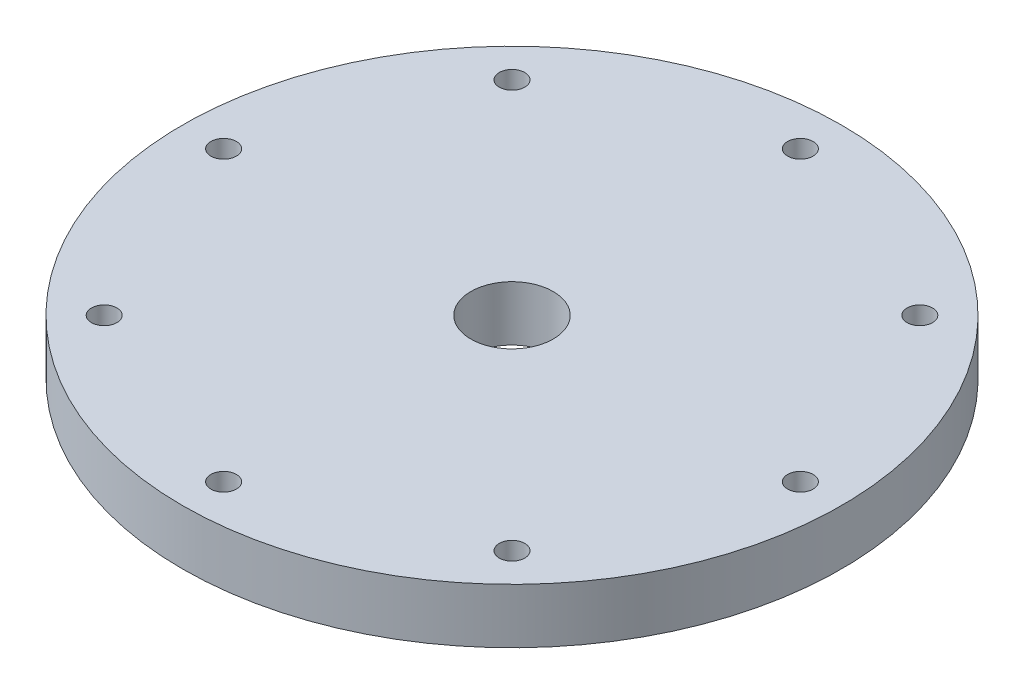
ISO-10303-21;
HEADER;
FILE_DESCRIPTION(('STEP AP214'),'2;1');
FILE_NAME('part.step','',(''),(''),'','','');
FILE_SCHEMA(('AUTOMOTIVE_DESIGN { 1 0 10303 214 1 1 1 1 }'));
ENDSEC;
DATA;
#1=APPLICATION_CONTEXT('core data for automotive mechanical design processes');
#2=APPLICATION_PROTOCOL_DEFINITION('international standard','automotive_design',2000,#1);
#3=PRODUCT_CONTEXT('',#1,'mechanical');
#4=PRODUCT('Part','Part','',(#3));
#5=PRODUCT_RELATED_PRODUCT_CATEGORY('part','',(#4));
#6=PRODUCT_DEFINITION_FORMATION('','',#4);
#7=PRODUCT_DEFINITION_CONTEXT('part definition',#1,'design');
#8=PRODUCT_DEFINITION('design','',#6,#7);
#9=PRODUCT_DEFINITION_SHAPE('','',#8);
#10=(LENGTH_UNIT() NAMED_UNIT(*) SI_UNIT(.MILLI.,.METRE.));
#11=(NAMED_UNIT(*) PLANE_ANGLE_UNIT() SI_UNIT($,.RADIAN.));
#12=(NAMED_UNIT(*) SI_UNIT($,.STERADIAN.) SOLID_ANGLE_UNIT());
#13=UNCERTAINTY_MEASURE_WITH_UNIT(LENGTH_MEASURE(1.E-05),#10,'distance_accuracy_value','');
#14=(GEOMETRIC_REPRESENTATION_CONTEXT(3) GLOBAL_UNCERTAINTY_ASSIGNED_CONTEXT((#13)) GLOBAL_UNIT_ASSIGNED_CONTEXT((#10,
#11,#12)) REPRESENTATION_CONTEXT('',''));
#15=CARTESIAN_POINT('',(0.,0.,0.));
#16=DIRECTION('',(0.,0.,1.));
#17=DIRECTION('',(1.,0.,0.));
#18=AXIS2_PLACEMENT_3D('',#15,#16,#17);
#19=CARTESIAN_POINT('',(0.,6.35,0.));
#20=DIRECTION('',(0.,-1.,0.));
#21=DIRECTION('',(0.,0.,-1.));
#22=AXIS2_PLACEMENT_3D('',#19,#20,#21);
#23=CYLINDRICAL_SURFACE('',#22,38.1);
#24=CARTESIAN_POINT('',(0.,6.35,0.));
#25=DIRECTION('',(0.,1.,0.));
#26=DIRECTION('',(0.,0.,1.));
#27=AXIS2_PLACEMENT_3D('',#24,#25,#26);
#28=CIRCLE('',#27,38.1);
#29=CARTESIAN_POINT('',(0.,6.35,38.1));
#30=VERTEX_POINT('',#29);
#31=EDGE_CURVE('E10',#30,#30,#28,.T.);
#32=ORIENTED_EDGE('',*,*,#31,.F.);
#33=EDGE_LOOP('',(#32));
#34=FACE_BOUND('',#33,.T.);
#35=CARTESIAN_POINT('',(0.,0.,0.));
#36=DIRECTION('',(0.,1.,0.));
#37=DIRECTION('',(0.,0.,1.));
#38=AXIS2_PLACEMENT_3D('',#35,#36,#37);
#39=CIRCLE('',#38,38.1);
#40=CARTESIAN_POINT('',(0.,0.,38.1));
#41=VERTEX_POINT('',#40);
#42=EDGE_CURVE('E34',#41,#41,#39,.T.);
#43=ORIENTED_EDGE('',*,*,#42,.T.);
#44=EDGE_LOOP('',(#43));
#45=FACE_BOUND('',#44,.T.);
#46=ADVANCED_FACE('F31',(#34,#45),#23,.T.);
#47=CARTESIAN_POINT('',(0.,6.35,0.));
#48=DIRECTION('',(0.,1.,0.));
#49=DIRECTION('',(0.,0.,1.));
#50=AXIS2_PLACEMENT_3D('',#47,#48,#49);
#51=PLANE('',#50);
#52=CARTESIAN_POINT('',(0.,6.35,0.));
#53=DIRECTION('',(0.,-1.,0.));
#54=DIRECTION('',(0.,0.,-1.));
#55=AXIS2_PLACEMENT_3D('',#52,#53,#54);
#56=CIRCLE('',#55,4.7625);
#57=CARTESIAN_POINT('',(0.,6.35,-4.7625));
#58=VERTEX_POINT('',#57);
#59=EDGE_CURVE('E138',#58,#58,#56,.T.);
#60=ORIENTED_EDGE('',*,*,#59,.T.);
#61=EDGE_LOOP('',(#60));
#62=FACE_BOUND('',#61,.T.);
#63=CARTESIAN_POINT('',(-23.5731723178062,6.35,23.5731723178068));
#64=DIRECTION('',(0.,-1.,0.));
#65=DIRECTION('',(0.,0.,-1.));
#66=AXIS2_PLACEMENT_3D('',#63,#64,#65);
#67=CIRCLE('',#66,1.4732);
#68=CARTESIAN_POINT('',(-23.5731723178062,6.35,22.0999723178068));
#69=VERTEX_POINT('',#68);
#70=EDGE_CURVE('E126',#69,#69,#67,.T.);
#71=ORIENTED_EDGE('',*,*,#70,.T.);
#72=EDGE_LOOP('',(#71));
#73=FACE_BOUND('',#72,.T.);
#74=CARTESIAN_POINT('',(-33.3375,6.35,3.49191777401049E-13));
#75=DIRECTION('',(0.,-1.,0.));
#76=DIRECTION('',(0.,0.,-1.));
#77=AXIS2_PLACEMENT_3D('',#74,#75,#76);
#78=CIRCLE('',#77,1.4732);
#79=CARTESIAN_POINT('',(-33.3375,6.35,-1.47319999999965));
#80=VERTEX_POINT('',#79);
#81=EDGE_CURVE('E114',#80,#80,#78,.T.);
#82=ORIENTED_EDGE('',*,*,#81,.T.);
#83=EDGE_LOOP('',(#82));
#84=FACE_BOUND('',#83,.T.);
#85=CARTESIAN_POINT('',(-23.5731723178067,6.35,-23.5731723178063));
#86=DIRECTION('',(0.,-1.,0.));
#87=DIRECTION('',(0.,0.,-1.));
#88=AXIS2_PLACEMENT_3D('',#85,#86,#87);
#89=CIRCLE('',#88,1.4732);
#90=CARTESIAN_POINT('',(-23.5731723178067,6.35,-25.0463723178063));
#91=VERTEX_POINT('',#90);
#92=EDGE_CURVE('E102',#91,#91,#89,.T.);
#93=ORIENTED_EDGE('',*,*,#92,.T.);
#94=EDGE_LOOP('',(#93));
#95=FACE_BOUND('',#94,.T.);
#96=CARTESIAN_POINT('',(0.,6.35,-33.3375));
#97=DIRECTION('',(0.,-1.,0.));
#98=DIRECTION('',(0.,0.,-1.));
#99=AXIS2_PLACEMENT_3D('',#96,#97,#98);
#100=CIRCLE('',#99,1.4732);
#101=CARTESIAN_POINT('',(0.,6.35,-34.8107));
#102=VERTEX_POINT('',#101);
#103=EDGE_CURVE('E90',#102,#102,#100,.T.);
#104=ORIENTED_EDGE('',*,*,#103,.T.);
#105=EDGE_LOOP('',(#104));
#106=FACE_BOUND('',#105,.T.);
#107=CARTESIAN_POINT('',(23.5731723178064,6.35,-23.5731723178067));
#108=DIRECTION('',(0.,-1.,0.));
#109=DIRECTION('',(0.,0.,-1.));
#110=AXIS2_PLACEMENT_3D('',#107,#108,#109);
#111=CIRCLE('',#110,1.4732);
#112=CARTESIAN_POINT('',(23.5731723178064,6.35,-25.0463723178067));
#113=VERTEX_POINT('',#112);
#114=EDGE_CURVE('E78',#113,#113,#111,.T.);
#115=ORIENTED_EDGE('',*,*,#114,.T.);
#116=EDGE_LOOP('',(#115));
#117=FACE_BOUND('',#116,.T.);
#118=CARTESIAN_POINT('',(33.3375,6.35,-1.16397259133683E-13));
#119=DIRECTION('',(0.,-1.,0.));
#120=DIRECTION('',(0.,0.,-1.));
#121=AXIS2_PLACEMENT_3D('',#118,#119,#120);
#122=CIRCLE('',#121,1.4732);
#123=CARTESIAN_POINT('',(33.3375,6.35,-1.47320000000012));
#124=VERTEX_POINT('',#123);
#125=EDGE_CURVE('E66',#124,#124,#122,.T.);
#126=ORIENTED_EDGE('',*,*,#125,.T.);
#127=EDGE_LOOP('',(#126));
#128=FACE_BOUND('',#127,.T.);
#129=CARTESIAN_POINT('',(23.5731723178066,6.35,23.5731723178065));
#130=DIRECTION('',(0.,-1.,0.));
#131=DIRECTION('',(0.,0.,-1.));
#132=AXIS2_PLACEMENT_3D('',#129,#130,#131);
#133=CIRCLE('',#132,1.4732);
#134=CARTESIAN_POINT('',(23.5731723178066,6.35,22.0999723178065));
#135=VERTEX_POINT('',#134);
#136=EDGE_CURVE('E54',#135,#135,#133,.T.);
#137=ORIENTED_EDGE('',*,*,#136,.T.);
#138=EDGE_LOOP('',(#137));
#139=FACE_BOUND('',#138,.T.);
#140=CARTESIAN_POINT('',(0.,6.35,33.3375));
#141=DIRECTION('',(0.,-1.,0.));
#142=DIRECTION('',(0.,0.,-1.));
#143=AXIS2_PLACEMENT_3D('',#140,#141,#142);
#144=CIRCLE('',#143,1.4732);
#145=CARTESIAN_POINT('',(0.,6.35,31.8643));
#146=VERTEX_POINT('',#145);
#147=EDGE_CURVE('E41',#146,#146,#144,.T.);
#148=ORIENTED_EDGE('',*,*,#147,.T.);
#149=EDGE_LOOP('',(#148));
#150=FACE_BOUND('',#149,.T.);
#151=ORIENTED_EDGE('',*,*,#31,.T.);
#152=EDGE_LOOP('',(#151));
#153=FACE_BOUND('',#152,.T.);
#154=ADVANCED_FACE('F145',(#62,#73,#84,#95,#106,#117,#128,#139,#150,#153),#51,.T.);
#155=CARTESIAN_POINT('',(0.,0.,0.));
#156=DIRECTION('',(0.,1.,0.));
#157=DIRECTION('',(0.,0.,1.));
#158=AXIS2_PLACEMENT_3D('',#155,#156,#157);
#159=PLANE('',#158);
#160=CARTESIAN_POINT('',(0.,0.,0.));
#161=DIRECTION('',(0.,-1.,0.));
#162=DIRECTION('',(0.,0.,-1.));
#163=AXIS2_PLACEMENT_3D('',#160,#161,#162);
#164=CIRCLE('',#163,4.7625);
#165=CARTESIAN_POINT('',(0.,0.,-4.7625));
#166=VERTEX_POINT('',#165);
#167=EDGE_CURVE('E139',#166,#166,#164,.T.);
#168=ORIENTED_EDGE('',*,*,#167,.F.);
#169=EDGE_LOOP('',(#168));
#170=FACE_BOUND('',#169,.T.);
#171=CARTESIAN_POINT('',(-23.5731723178062,0.,23.5731723178068));
#172=DIRECTION('',(0.,-1.,0.));
#173=DIRECTION('',(0.,0.,-1.));
#174=AXIS2_PLACEMENT_3D('',#171,#172,#173);
#175=CIRCLE('',#174,2.8575);
#176=CARTESIAN_POINT('',(-23.5731723178062,0.,20.7156723178068));
#177=VERTEX_POINT('',#176);
#178=EDGE_CURVE('E135',#177,#177,#175,.T.);
#179=ORIENTED_EDGE('',*,*,#178,.F.);
#180=EDGE_LOOP('',(#179));
#181=FACE_BOUND('',#180,.T.);
#182=CARTESIAN_POINT('',(-33.3375,0.,3.49191777401049E-13));
#183=DIRECTION('',(0.,-1.,0.));
#184=DIRECTION('',(0.,0.,-1.));
#185=AXIS2_PLACEMENT_3D('',#182,#183,#184);
#186=CIRCLE('',#185,2.8575);
#187=CARTESIAN_POINT('',(-33.3375,0.,-2.85749999999965));
#188=VERTEX_POINT('',#187);
#189=EDGE_CURVE('E123',#188,#188,#186,.T.);
#190=ORIENTED_EDGE('',*,*,#189,.F.);
#191=EDGE_LOOP('',(#190));
#192=FACE_BOUND('',#191,.T.);
#193=CARTESIAN_POINT('',(-23.5731723178067,0.,-23.5731723178063));
#194=DIRECTION('',(0.,-1.,0.));
#195=DIRECTION('',(0.,0.,-1.));
#196=AXIS2_PLACEMENT_3D('',#193,#194,#195);
#197=CIRCLE('',#196,2.8575);
#198=CARTESIAN_POINT('',(-23.5731723178067,0.,-26.4306723178063));
#199=VERTEX_POINT('',#198);
#200=EDGE_CURVE('E111',#199,#199,#197,.T.);
#201=ORIENTED_EDGE('',*,*,#200,.F.);
#202=EDGE_LOOP('',(#201));
#203=FACE_BOUND('',#202,.T.);
#204=CARTESIAN_POINT('',(0.,0.,-33.3375));
#205=DIRECTION('',(0.,-1.,0.));
#206=DIRECTION('',(0.,0.,-1.));
#207=AXIS2_PLACEMENT_3D('',#204,#205,#206);
#208=CIRCLE('',#207,2.8575);
#209=CARTESIAN_POINT('',(0.,0.,-36.195));
#210=VERTEX_POINT('',#209);
#211=EDGE_CURVE('E99',#210,#210,#208,.T.);
#212=ORIENTED_EDGE('',*,*,#211,.F.);
#213=EDGE_LOOP('',(#212));
#214=FACE_BOUND('',#213,.T.);
#215=CARTESIAN_POINT('',(23.5731723178064,0.,-23.5731723178067));
#216=DIRECTION('',(0.,-1.,0.));
#217=DIRECTION('',(0.,0.,-1.));
#218=AXIS2_PLACEMENT_3D('',#215,#216,#217);
#219=CIRCLE('',#218,2.8575);
#220=CARTESIAN_POINT('',(23.5731723178064,0.,-26.4306723178066));
#221=VERTEX_POINT('',#220);
#222=EDGE_CURVE('E87',#221,#221,#219,.T.);
#223=ORIENTED_EDGE('',*,*,#222,.F.);
#224=EDGE_LOOP('',(#223));
#225=FACE_BOUND('',#224,.T.);
#226=CARTESIAN_POINT('',(33.3375,0.,-1.16397259133683E-13));
#227=DIRECTION('',(0.,-1.,0.));
#228=DIRECTION('',(0.,0.,-1.));
#229=AXIS2_PLACEMENT_3D('',#226,#227,#228);
#230=CIRCLE('',#229,2.8575);
#231=CARTESIAN_POINT('',(33.3375,0.,-2.85750000000011));
#232=VERTEX_POINT('',#231);
#233=EDGE_CURVE('E75',#232,#232,#230,.T.);
#234=ORIENTED_EDGE('',*,*,#233,.F.);
#235=EDGE_LOOP('',(#234));
#236=FACE_BOUND('',#235,.T.);
#237=CARTESIAN_POINT('',(23.5731723178066,0.,23.5731723178065));
#238=DIRECTION('',(0.,-1.,0.));
#239=DIRECTION('',(0.,0.,-1.));
#240=AXIS2_PLACEMENT_3D('',#237,#238,#239);
#241=CIRCLE('',#240,2.8575);
#242=CARTESIAN_POINT('',(23.5731723178066,0.,20.7156723178065));
#243=VERTEX_POINT('',#242);
#244=EDGE_CURVE('E63',#243,#243,#241,.T.);
#245=ORIENTED_EDGE('',*,*,#244,.F.);
#246=EDGE_LOOP('',(#245));
#247=FACE_BOUND('',#246,.T.);
#248=CARTESIAN_POINT('',(0.,0.,33.3375));
#249=DIRECTION('',(0.,-1.,0.));
#250=DIRECTION('',(0.,0.,-1.));
#251=AXIS2_PLACEMENT_3D('',#248,#249,#250);
#252=CIRCLE('',#251,2.8575);
#253=CARTESIAN_POINT('',(0.,0.,30.48));
#254=VERTEX_POINT('',#253);
#255=EDGE_CURVE('E51',#254,#254,#252,.T.);
#256=ORIENTED_EDGE('',*,*,#255,.F.);
#257=EDGE_LOOP('',(#256));
#258=FACE_BOUND('',#257,.T.);
#259=ORIENTED_EDGE('',*,*,#42,.F.);
#260=EDGE_LOOP('',(#259));
#261=FACE_BOUND('',#260,.T.);
#262=ADVANCED_FACE('F155',(#170,#181,#192,#203,#214,#225,#236,#247,#258,#261),#159,.F.);
#263=CARTESIAN_POINT('',(0.,0.,33.3375));
#264=DIRECTION('',(0.,-1.,0.));
#265=DIRECTION('',(0.,0.,-1.));
#266=AXIS2_PLACEMENT_3D('',#263,#264,#265);
#267=CYLINDRICAL_SURFACE('',#266,1.4732);
#268=ORIENTED_EDGE('',*,*,#147,.F.);
#269=EDGE_LOOP('',(#268));
#270=FACE_BOUND('',#269,.T.);
#271=CARTESIAN_POINT('',(0.,1.4986,33.3375));
#272=DIRECTION('',(0.,-1.,0.));
#273=DIRECTION('',(0.,0.,-1.));
#274=AXIS2_PLACEMENT_3D('',#271,#272,#273);
#275=CIRCLE('',#274,1.4732);
#276=CARTESIAN_POINT('',(0.,1.4986,31.8643));
#277=VERTEX_POINT('',#276);
#278=EDGE_CURVE('E45',#277,#277,#275,.T.);
#279=ORIENTED_EDGE('',*,*,#278,.T.);
#280=EDGE_LOOP('',(#279));
#281=FACE_BOUND('',#280,.T.);
#282=ADVANCED_FACE('F158',(#270,#281),#267,.F.);
#283=CARTESIAN_POINT('',(1.4732,1.4986,33.3375));
#284=DIRECTION('',(0.,1.,0.));
#285=DIRECTION('',(0.,0.,1.));
#286=AXIS2_PLACEMENT_3D('',#283,#284,#285);
#287=PLANE('',#286);
#288=ORIENTED_EDGE('',*,*,#278,.F.);
#289=EDGE_LOOP('',(#288));
#290=FACE_BOUND('',#289,.T.);
#291=CARTESIAN_POINT('',(0.,1.4986,33.3375));
#292=DIRECTION('',(0.,-1.,0.));
#293=DIRECTION('',(0.,0.,-1.));
#294=AXIS2_PLACEMENT_3D('',#291,#292,#293);
#295=CIRCLE('',#294,2.8575);
#296=CARTESIAN_POINT('',(0.,1.4986,30.48));
#297=VERTEX_POINT('',#296);
#298=EDGE_CURVE('E48',#297,#297,#295,.T.);
#299=ORIENTED_EDGE('',*,*,#298,.T.);
#300=EDGE_LOOP('',(#299));
#301=FACE_BOUND('',#300,.T.);
#302=ADVANCED_FACE('F188',(#290,#301),#287,.F.);
#303=CARTESIAN_POINT('',(0.,0.,33.3375));
#304=DIRECTION('',(0.,-1.,0.));
#305=DIRECTION('',(0.,0.,-1.));
#306=AXIS2_PLACEMENT_3D('',#303,#304,#305);
#307=CYLINDRICAL_SURFACE('',#306,2.8575);
#308=ORIENTED_EDGE('',*,*,#298,.F.);
#309=EDGE_LOOP('',(#308));
#310=FACE_BOUND('',#309,.T.);
#311=ORIENTED_EDGE('',*,*,#255,.T.);
#312=EDGE_LOOP('',(#311));
#313=FACE_BOUND('',#312,.T.);
#314=ADVANCED_FACE('F192',(#310,#313),#307,.F.);
#315=CARTESIAN_POINT('',(23.5731723178066,0.,23.5731723178065));
#316=DIRECTION('',(0.,-1.,0.));
#317=DIRECTION('',(0.,0.,-1.));
#318=AXIS2_PLACEMENT_3D('',#315,#316,#317);
#319=CYLINDRICAL_SURFACE('',#318,1.4732);
#320=ORIENTED_EDGE('',*,*,#136,.F.);
#321=EDGE_LOOP('',(#320));
#322=FACE_BOUND('',#321,.T.);
#323=CARTESIAN_POINT('',(23.5731723178066,1.4986,23.5731723178065));
#324=DIRECTION('',(0.,-1.,0.));
#325=DIRECTION('',(0.,0.,-1.));
#326=AXIS2_PLACEMENT_3D('',#323,#324,#325);
#327=CIRCLE('',#326,1.4732);
#328=CARTESIAN_POINT('',(23.5731723178066,1.4986,22.0999723178065));
#329=VERTEX_POINT('',#328);
#330=EDGE_CURVE('E57',#329,#329,#327,.T.);
#331=ORIENTED_EDGE('',*,*,#330,.T.);
#332=EDGE_LOOP('',(#331));
#333=FACE_BOUND('',#332,.T.);
#334=ADVANCED_FACE('F196',(#322,#333),#319,.F.);
#335=CARTESIAN_POINT('',(25.0463723178066,1.4986,23.5731723178065));
#336=DIRECTION('',(0.,1.,0.));
#337=DIRECTION('',(0.,0.,1.));
#338=AXIS2_PLACEMENT_3D('',#335,#336,#337);
#339=PLANE('',#338);
#340=ORIENTED_EDGE('',*,*,#330,.F.);
#341=EDGE_LOOP('',(#340));
#342=FACE_BOUND('',#341,.T.);
#343=CARTESIAN_POINT('',(23.5731723178066,1.4986,23.5731723178065));
#344=DIRECTION('',(0.,-1.,0.));
#345=DIRECTION('',(0.,0.,-1.));
#346=AXIS2_PLACEMENT_3D('',#343,#344,#345);
#347=CIRCLE('',#346,2.8575);
#348=CARTESIAN_POINT('',(23.5731723178066,1.4986,20.7156723178065));
#349=VERTEX_POINT('',#348);
#350=EDGE_CURVE('E60',#349,#349,#347,.T.);
#351=ORIENTED_EDGE('',*,*,#350,.T.);
#352=EDGE_LOOP('',(#351));
#353=FACE_BOUND('',#352,.T.);
#354=ADVANCED_FACE('F200',(#342,#353),#339,.F.);
#355=CARTESIAN_POINT('',(23.5731723178066,0.,23.5731723178065));
#356=DIRECTION('',(0.,-1.,0.));
#357=DIRECTION('',(0.,0.,-1.));
#358=AXIS2_PLACEMENT_3D('',#355,#356,#357);
#359=CYLINDRICAL_SURFACE('',#358,2.8575);
#360=ORIENTED_EDGE('',*,*,#350,.F.);
#361=EDGE_LOOP('',(#360));
#362=FACE_BOUND('',#361,.T.);
#363=ORIENTED_EDGE('',*,*,#244,.T.);
#364=EDGE_LOOP('',(#363));
#365=FACE_BOUND('',#364,.T.);
#366=ADVANCED_FACE('F204',(#362,#365),#359,.F.);
#367=CARTESIAN_POINT('',(33.3375,0.,-1.16397259133683E-13));
#368=DIRECTION('',(0.,-1.,0.));
#369=DIRECTION('',(0.,0.,-1.));
#370=AXIS2_PLACEMENT_3D('',#367,#368,#369);
#371=CYLINDRICAL_SURFACE('',#370,1.4732);
#372=ORIENTED_EDGE('',*,*,#125,.F.);
#373=EDGE_LOOP('',(#372));
#374=FACE_BOUND('',#373,.T.);
#375=CARTESIAN_POINT('',(33.3375,1.4986,-1.16397259133683E-13));
#376=DIRECTION('',(0.,-1.,0.));
#377=DIRECTION('',(0.,0.,-1.));
#378=AXIS2_PLACEMENT_3D('',#375,#376,#377);
#379=CIRCLE('',#378,1.4732);
#380=CARTESIAN_POINT('',(33.3375,1.4986,-1.47320000000012));
#381=VERTEX_POINT('',#380);
#382=EDGE_CURVE('E69',#381,#381,#379,.T.);
#383=ORIENTED_EDGE('',*,*,#382,.T.);
#384=EDGE_LOOP('',(#383));
#385=FACE_BOUND('',#384,.T.);
#386=ADVANCED_FACE('F208',(#374,#385),#371,.F.);
#387=CARTESIAN_POINT('',(34.8107,1.4986,-1.16397259133683E-13));
#388=DIRECTION('',(0.,1.,0.));
#389=DIRECTION('',(0.,0.,1.));
#390=AXIS2_PLACEMENT_3D('',#387,#388,#389);
#391=PLANE('',#390);
#392=ORIENTED_EDGE('',*,*,#382,.F.);
#393=EDGE_LOOP('',(#392));
#394=FACE_BOUND('',#393,.T.);
#395=CARTESIAN_POINT('',(33.3375,1.4986,-1.16397259133683E-13));
#396=DIRECTION('',(0.,-1.,0.));
#397=DIRECTION('',(0.,0.,-1.));
#398=AXIS2_PLACEMENT_3D('',#395,#396,#397);
#399=CIRCLE('',#398,2.8575);
#400=CARTESIAN_POINT('',(33.3375,1.4986,-2.85750000000011));
#401=VERTEX_POINT('',#400);
#402=EDGE_CURVE('E72',#401,#401,#399,.T.);
#403=ORIENTED_EDGE('',*,*,#402,.T.);
#404=EDGE_LOOP('',(#403));
#405=FACE_BOUND('',#404,.T.);
#406=ADVANCED_FACE('F212',(#394,#405),#391,.F.);
#407=CARTESIAN_POINT('',(33.3375,0.,-1.16397259133683E-13));
#408=DIRECTION('',(0.,-1.,0.));
#409=DIRECTION('',(0.,0.,-1.));
#410=AXIS2_PLACEMENT_3D('',#407,#408,#409);
#411=CYLINDRICAL_SURFACE('',#410,2.8575);
#412=ORIENTED_EDGE('',*,*,#402,.F.);
#413=EDGE_LOOP('',(#412));
#414=FACE_BOUND('',#413,.T.);
#415=ORIENTED_EDGE('',*,*,#233,.T.);
#416=EDGE_LOOP('',(#415));
#417=FACE_BOUND('',#416,.T.);
#418=ADVANCED_FACE('F216',(#414,#417),#411,.F.);
#419=CARTESIAN_POINT('',(23.5731723178064,0.,-23.5731723178067));
#420=DIRECTION('',(0.,-1.,0.));
#421=DIRECTION('',(0.,0.,-1.));
#422=AXIS2_PLACEMENT_3D('',#419,#420,#421);
#423=CYLINDRICAL_SURFACE('',#422,1.4732);
#424=ORIENTED_EDGE('',*,*,#114,.F.);
#425=EDGE_LOOP('',(#424));
#426=FACE_BOUND('',#425,.T.);
#427=CARTESIAN_POINT('',(23.5731723178064,1.4986,-23.5731723178067));
#428=DIRECTION('',(0.,-1.,0.));
#429=DIRECTION('',(0.,0.,-1.));
#430=AXIS2_PLACEMENT_3D('',#427,#428,#429);
#431=CIRCLE('',#430,1.4732);
#432=CARTESIAN_POINT('',(23.5731723178064,1.4986,-25.0463723178067));
#433=VERTEX_POINT('',#432);
#434=EDGE_CURVE('E81',#433,#433,#431,.T.);
#435=ORIENTED_EDGE('',*,*,#434,.T.);
#436=EDGE_LOOP('',(#435));
#437=FACE_BOUND('',#436,.T.);
#438=ADVANCED_FACE('F220',(#426,#437),#423,.F.);
#439=CARTESIAN_POINT('',(25.0463723178064,1.4986,-23.5731723178067));
#440=DIRECTION('',(0.,1.,0.));
#441=DIRECTION('',(0.,0.,1.));
#442=AXIS2_PLACEMENT_3D('',#439,#440,#441);
#443=PLANE('',#442);
#444=ORIENTED_EDGE('',*,*,#434,.F.);
#445=EDGE_LOOP('',(#444));
#446=FACE_BOUND('',#445,.T.);
#447=CARTESIAN_POINT('',(23.5731723178064,1.4986,-23.5731723178067));
#448=DIRECTION('',(0.,-1.,0.));
#449=DIRECTION('',(0.,0.,-1.));
#450=AXIS2_PLACEMENT_3D('',#447,#448,#449);
#451=CIRCLE('',#450,2.8575);
#452=CARTESIAN_POINT('',(23.5731723178064,1.4986,-26.4306723178066));
#453=VERTEX_POINT('',#452);
#454=EDGE_CURVE('E84',#453,#453,#451,.T.);
#455=ORIENTED_EDGE('',*,*,#454,.T.);
#456=EDGE_LOOP('',(#455));
#457=FACE_BOUND('',#456,.T.);
#458=ADVANCED_FACE('F224',(#446,#457),#443,.F.);
#459=CARTESIAN_POINT('',(23.5731723178064,0.,-23.5731723178067));
#460=DIRECTION('',(0.,-1.,0.));
#461=DIRECTION('',(0.,0.,-1.));
#462=AXIS2_PLACEMENT_3D('',#459,#460,#461);
#463=CYLINDRICAL_SURFACE('',#462,2.8575);
#464=ORIENTED_EDGE('',*,*,#454,.F.);
#465=EDGE_LOOP('',(#464));
#466=FACE_BOUND('',#465,.T.);
#467=ORIENTED_EDGE('',*,*,#222,.T.);
#468=EDGE_LOOP('',(#467));
#469=FACE_BOUND('',#468,.T.);
#470=ADVANCED_FACE('F228',(#466,#469),#463,.F.);
#471=CARTESIAN_POINT('',(0.,0.,-33.3375));
#472=DIRECTION('',(0.,-1.,0.));
#473=DIRECTION('',(0.,0.,-1.));
#474=AXIS2_PLACEMENT_3D('',#471,#472,#473);
#475=CYLINDRICAL_SURFACE('',#474,1.4732);
#476=ORIENTED_EDGE('',*,*,#103,.F.);
#477=EDGE_LOOP('',(#476));
#478=FACE_BOUND('',#477,.T.);
#479=CARTESIAN_POINT('',(0.,1.4986,-33.3375));
#480=DIRECTION('',(0.,-1.,0.));
#481=DIRECTION('',(0.,0.,-1.));
#482=AXIS2_PLACEMENT_3D('',#479,#480,#481);
#483=CIRCLE('',#482,1.4732);
#484=CARTESIAN_POINT('',(0.,1.4986,-34.8107));
#485=VERTEX_POINT('',#484);
#486=EDGE_CURVE('E93',#485,#485,#483,.T.);
#487=ORIENTED_EDGE('',*,*,#486,.T.);
#488=EDGE_LOOP('',(#487));
#489=FACE_BOUND('',#488,.T.);
#490=ADVANCED_FACE('F232',(#478,#489),#475,.F.);
#491=CARTESIAN_POINT('',(1.4732,1.4986,-33.3375));
#492=DIRECTION('',(0.,1.,0.));
#493=DIRECTION('',(0.,0.,1.));
#494=AXIS2_PLACEMENT_3D('',#491,#492,#493);
#495=PLANE('',#494);
#496=ORIENTED_EDGE('',*,*,#486,.F.);
#497=EDGE_LOOP('',(#496));
#498=FACE_BOUND('',#497,.T.);
#499=CARTESIAN_POINT('',(0.,1.4986,-33.3375));
#500=DIRECTION('',(0.,-1.,0.));
#501=DIRECTION('',(0.,0.,-1.));
#502=AXIS2_PLACEMENT_3D('',#499,#500,#501);
#503=CIRCLE('',#502,2.8575);
#504=CARTESIAN_POINT('',(0.,1.4986,-36.195));
#505=VERTEX_POINT('',#504);
#506=EDGE_CURVE('E96',#505,#505,#503,.T.);
#507=ORIENTED_EDGE('',*,*,#506,.T.);
#508=EDGE_LOOP('',(#507));
#509=FACE_BOUND('',#508,.T.);
#510=ADVANCED_FACE('F236',(#498,#509),#495,.F.);
#511=CARTESIAN_POINT('',(0.,0.,-33.3375));
#512=DIRECTION('',(0.,-1.,0.));
#513=DIRECTION('',(0.,0.,-1.));
#514=AXIS2_PLACEMENT_3D('',#511,#512,#513);
#515=CYLINDRICAL_SURFACE('',#514,2.8575);
#516=ORIENTED_EDGE('',*,*,#506,.F.);
#517=EDGE_LOOP('',(#516));
#518=FACE_BOUND('',#517,.T.);
#519=ORIENTED_EDGE('',*,*,#211,.T.);
#520=EDGE_LOOP('',(#519));
#521=FACE_BOUND('',#520,.T.);
#522=ADVANCED_FACE('F240',(#518,#521),#515,.F.);
#523=CARTESIAN_POINT('',(-23.5731723178067,0.,-23.5731723178063));
#524=DIRECTION('',(0.,-1.,0.));
#525=DIRECTION('',(0.,0.,-1.));
#526=AXIS2_PLACEMENT_3D('',#523,#524,#525);
#527=CYLINDRICAL_SURFACE('',#526,1.4732);
#528=ORIENTED_EDGE('',*,*,#92,.F.);
#529=EDGE_LOOP('',(#528));
#530=FACE_BOUND('',#529,.T.);
#531=CARTESIAN_POINT('',(-23.5731723178067,1.4986,-23.5731723178063));
#532=DIRECTION('',(0.,-1.,0.));
#533=DIRECTION('',(0.,0.,-1.));
#534=AXIS2_PLACEMENT_3D('',#531,#532,#533);
#535=CIRCLE('',#534,1.4732);
#536=CARTESIAN_POINT('',(-23.5731723178067,1.4986,-25.0463723178063));
#537=VERTEX_POINT('',#536);
#538=EDGE_CURVE('E105',#537,#537,#535,.T.);
#539=ORIENTED_EDGE('',*,*,#538,.T.);
#540=EDGE_LOOP('',(#539));
#541=FACE_BOUND('',#540,.T.);
#542=ADVANCED_FACE('F244',(#530,#541),#527,.F.);
#543=CARTESIAN_POINT('',(-22.0999723178067,1.4986,-23.5731723178063));
#544=DIRECTION('',(0.,1.,0.));
#545=DIRECTION('',(0.,0.,1.));
#546=AXIS2_PLACEMENT_3D('',#543,#544,#545);
#547=PLANE('',#546);
#548=ORIENTED_EDGE('',*,*,#538,.F.);
#549=EDGE_LOOP('',(#548));
#550=FACE_BOUND('',#549,.T.);
#551=CARTESIAN_POINT('',(-23.5731723178067,1.4986,-23.5731723178063));
#552=DIRECTION('',(0.,-1.,0.));
#553=DIRECTION('',(0.,0.,-1.));
#554=AXIS2_PLACEMENT_3D('',#551,#552,#553);
#555=CIRCLE('',#554,2.8575);
#556=CARTESIAN_POINT('',(-23.5731723178067,1.4986,-26.4306723178063));
#557=VERTEX_POINT('',#556);
#558=EDGE_CURVE('E108',#557,#557,#555,.T.);
#559=ORIENTED_EDGE('',*,*,#558,.T.);
#560=EDGE_LOOP('',(#559));
#561=FACE_BOUND('',#560,.T.);
#562=ADVANCED_FACE('F248',(#550,#561),#547,.F.);
#563=CARTESIAN_POINT('',(-23.5731723178067,0.,-23.5731723178063));
#564=DIRECTION('',(0.,-1.,0.));
#565=DIRECTION('',(0.,0.,-1.));
#566=AXIS2_PLACEMENT_3D('',#563,#564,#565);
#567=CYLINDRICAL_SURFACE('',#566,2.8575);
#568=ORIENTED_EDGE('',*,*,#558,.F.);
#569=EDGE_LOOP('',(#568));
#570=FACE_BOUND('',#569,.T.);
#571=ORIENTED_EDGE('',*,*,#200,.T.);
#572=EDGE_LOOP('',(#571));
#573=FACE_BOUND('',#572,.T.);
#574=ADVANCED_FACE('F252',(#570,#573),#567,.F.);
#575=CARTESIAN_POINT('',(-33.3375,0.,3.49191777401049E-13));
#576=DIRECTION('',(0.,-1.,0.));
#577=DIRECTION('',(0.,0.,-1.));
#578=AXIS2_PLACEMENT_3D('',#575,#576,#577);
#579=CYLINDRICAL_SURFACE('',#578,1.4732);
#580=ORIENTED_EDGE('',*,*,#81,.F.);
#581=EDGE_LOOP('',(#580));
#582=FACE_BOUND('',#581,.T.);
#583=CARTESIAN_POINT('',(-33.3375,1.4986,3.49191777401049E-13));
#584=DIRECTION('',(0.,-1.,0.));
#585=DIRECTION('',(0.,0.,-1.));
#586=AXIS2_PLACEMENT_3D('',#583,#584,#585);
#587=CIRCLE('',#586,1.4732);
#588=CARTESIAN_POINT('',(-33.3375,1.4986,-1.47319999999965));
#589=VERTEX_POINT('',#588);
#590=EDGE_CURVE('E117',#589,#589,#587,.T.);
#591=ORIENTED_EDGE('',*,*,#590,.T.);
#592=EDGE_LOOP('',(#591));
#593=FACE_BOUND('',#592,.T.);
#594=ADVANCED_FACE('F256',(#582,#593),#579,.F.);
#595=CARTESIAN_POINT('',(-31.8643,1.4986,3.49191777401049E-13));
#596=DIRECTION('',(0.,1.,0.));
#597=DIRECTION('',(0.,0.,1.));
#598=AXIS2_PLACEMENT_3D('',#595,#596,#597);
#599=PLANE('',#598);
#600=ORIENTED_EDGE('',*,*,#590,.F.);
#601=EDGE_LOOP('',(#600));
#602=FACE_BOUND('',#601,.T.);
#603=CARTESIAN_POINT('',(-33.3375,1.4986,3.49191777401049E-13));
#604=DIRECTION('',(0.,-1.,0.));
#605=DIRECTION('',(0.,0.,-1.));
#606=AXIS2_PLACEMENT_3D('',#603,#604,#605);
#607=CIRCLE('',#606,2.8575);
#608=CARTESIAN_POINT('',(-33.3375,1.4986,-2.85749999999965));
#609=VERTEX_POINT('',#608);
#610=EDGE_CURVE('E120',#609,#609,#607,.T.);
#611=ORIENTED_EDGE('',*,*,#610,.T.);
#612=EDGE_LOOP('',(#611));
#613=FACE_BOUND('',#612,.T.);
#614=ADVANCED_FACE('F260',(#602,#613),#599,.F.);
#615=CARTESIAN_POINT('',(-33.3375,0.,3.49191777401049E-13));
#616=DIRECTION('',(0.,-1.,0.));
#617=DIRECTION('',(0.,0.,-1.));
#618=AXIS2_PLACEMENT_3D('',#615,#616,#617);
#619=CYLINDRICAL_SURFACE('',#618,2.8575);
#620=ORIENTED_EDGE('',*,*,#610,.F.);
#621=EDGE_LOOP('',(#620));
#622=FACE_BOUND('',#621,.T.);
#623=ORIENTED_EDGE('',*,*,#189,.T.);
#624=EDGE_LOOP('',(#623));
#625=FACE_BOUND('',#624,.T.);
#626=ADVANCED_FACE('F264',(#622,#625),#619,.F.);
#627=CARTESIAN_POINT('',(-23.5731723178062,0.,23.5731723178068));
#628=DIRECTION('',(0.,-1.,0.));
#629=DIRECTION('',(0.,0.,-1.));
#630=AXIS2_PLACEMENT_3D('',#627,#628,#629);
#631=CYLINDRICAL_SURFACE('',#630,1.4732);
#632=ORIENTED_EDGE('',*,*,#70,.F.);
#633=EDGE_LOOP('',(#632));
#634=FACE_BOUND('',#633,.T.);
#635=CARTESIAN_POINT('',(-23.5731723178062,1.4986,23.5731723178068));
#636=DIRECTION('',(0.,-1.,0.));
#637=DIRECTION('',(0.,0.,-1.));
#638=AXIS2_PLACEMENT_3D('',#635,#636,#637);
#639=CIRCLE('',#638,1.4732);
#640=CARTESIAN_POINT('',(-23.5731723178062,1.4986,22.0999723178068));
#641=VERTEX_POINT('',#640);
#642=EDGE_CURVE('E129',#641,#641,#639,.T.);
#643=ORIENTED_EDGE('',*,*,#642,.T.);
#644=EDGE_LOOP('',(#643));
#645=FACE_BOUND('',#644,.T.);
#646=ADVANCED_FACE('F268',(#634,#645),#631,.F.);
#647=CARTESIAN_POINT('',(-22.0999723178062,1.4986,23.5731723178068));
#648=DIRECTION('',(0.,1.,0.));
#649=DIRECTION('',(0.,0.,1.));
#650=AXIS2_PLACEMENT_3D('',#647,#648,#649);
#651=PLANE('',#650);
#652=ORIENTED_EDGE('',*,*,#642,.F.);
#653=EDGE_LOOP('',(#652));
#654=FACE_BOUND('',#653,.T.);
#655=CARTESIAN_POINT('',(-23.5731723178062,1.4986,23.5731723178068));
#656=DIRECTION('',(0.,-1.,0.));
#657=DIRECTION('',(0.,0.,-1.));
#658=AXIS2_PLACEMENT_3D('',#655,#656,#657);
#659=CIRCLE('',#658,2.8575);
#660=CARTESIAN_POINT('',(-23.5731723178062,1.4986,20.7156723178068));
#661=VERTEX_POINT('',#660);
#662=EDGE_CURVE('E132',#661,#661,#659,.T.);
#663=ORIENTED_EDGE('',*,*,#662,.T.);
#664=EDGE_LOOP('',(#663));
#665=FACE_BOUND('',#664,.T.);
#666=ADVANCED_FACE('F272',(#654,#665),#651,.F.);
#667=CARTESIAN_POINT('',(-23.5731723178062,0.,23.5731723178068));
#668=DIRECTION('',(0.,-1.,0.));
#669=DIRECTION('',(0.,0.,-1.));
#670=AXIS2_PLACEMENT_3D('',#667,#668,#669);
#671=CYLINDRICAL_SURFACE('',#670,2.8575);
#672=ORIENTED_EDGE('',*,*,#662,.F.);
#673=EDGE_LOOP('',(#672));
#674=FACE_BOUND('',#673,.T.);
#675=ORIENTED_EDGE('',*,*,#178,.T.);
#676=EDGE_LOOP('',(#675));
#677=FACE_BOUND('',#676,.T.);
#678=ADVANCED_FACE('F151',(#674,#677),#671,.F.);
#679=CARTESIAN_POINT('',(0.,6.35,0.));
#680=DIRECTION('',(0.,-1.,0.));
#681=DIRECTION('',(0.,0.,-1.));
#682=AXIS2_PLACEMENT_3D('',#679,#680,#681);
#683=CYLINDRICAL_SURFACE('',#682,4.7625);
#684=ORIENTED_EDGE('',*,*,#59,.F.);
#685=EDGE_LOOP('',(#684));
#686=FACE_BOUND('',#685,.T.);
#687=ORIENTED_EDGE('',*,*,#167,.T.);
#688=EDGE_LOOP('',(#687));
#689=FACE_BOUND('',#688,.T.);
#690=ADVANCED_FACE('F148',(#686,#689),#683,.F.);
#691=CLOSED_SHELL('',(#46,#154,#262,#282,#302,#314,#334,#354,#366,#386,#406,#418,#438,#458,#470,
#490,#510,#522,#542,#562,#574,#594,#614,#626,#646,#666,#678,#690));
#692=MANIFOLD_SOLID_BREP('B2',#691);
#693=ADVANCED_BREP_SHAPE_REPRESENTATION('',(#18,#692),#14);
#694=SHAPE_DEFINITION_REPRESENTATION(#9,#693);
ENDSEC;
END-ISO-10303-21;
